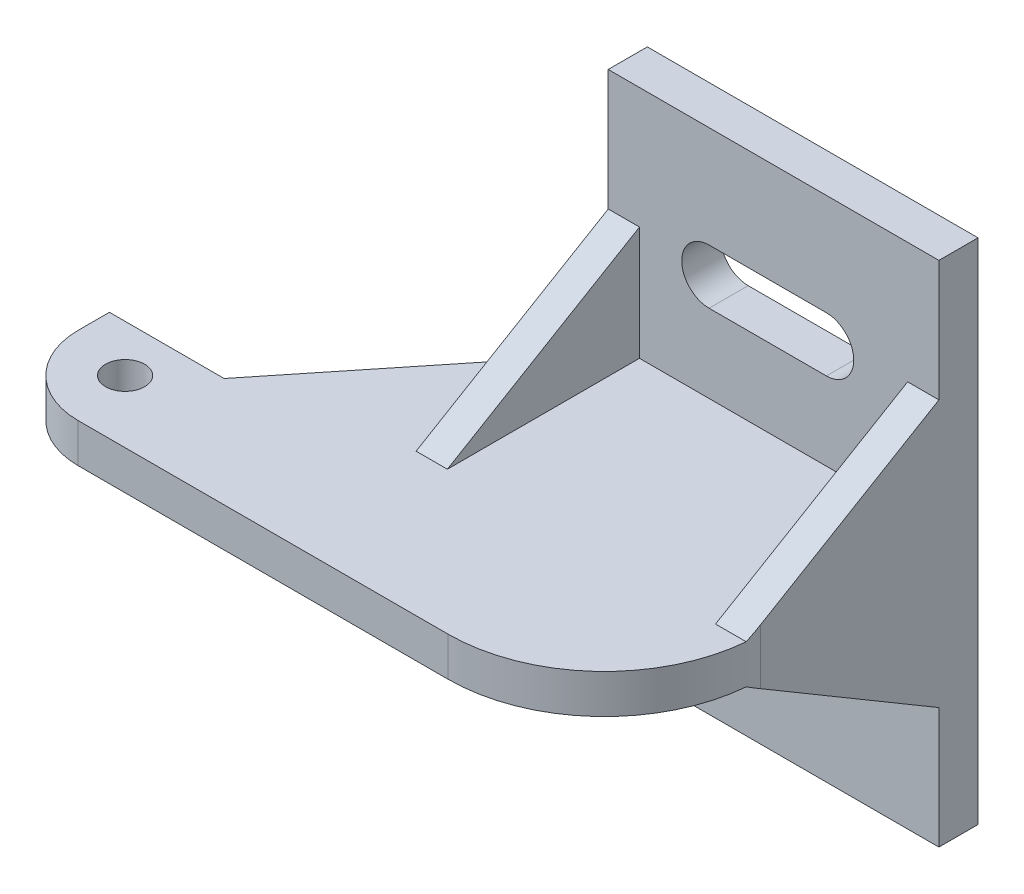
ISO-10303-21;
HEADER;
FILE_DESCRIPTION(('STEP AP214'),'2;1');
FILE_NAME('part.step','',(''),(''),'','','');
FILE_SCHEMA(('AUTOMOTIVE_DESIGN { 1 0 10303 214 1 1 1 1 }'));
ENDSEC;
DATA;
#1=APPLICATION_CONTEXT('core data for automotive mechanical design processes');
#2=APPLICATION_PROTOCOL_DEFINITION('international standard','automotive_design',2000,#1);
#3=PRODUCT_CONTEXT('',#1,'mechanical');
#4=PRODUCT('Part','Part','',(#3));
#5=PRODUCT_RELATED_PRODUCT_CATEGORY('part','',(#4));
#6=PRODUCT_DEFINITION_FORMATION('','',#4);
#7=PRODUCT_DEFINITION_CONTEXT('part definition',#1,'design');
#8=PRODUCT_DEFINITION('design','',#6,#7);
#9=PRODUCT_DEFINITION_SHAPE('','',#8);
#10=(LENGTH_UNIT() NAMED_UNIT(*) SI_UNIT(.MILLI.,.METRE.));
#11=(NAMED_UNIT(*) PLANE_ANGLE_UNIT() SI_UNIT($,.RADIAN.));
#12=(NAMED_UNIT(*) SI_UNIT($,.STERADIAN.) SOLID_ANGLE_UNIT());
#13=UNCERTAINTY_MEASURE_WITH_UNIT(LENGTH_MEASURE(1.E-05),#10,'distance_accuracy_value','');
#14=(GEOMETRIC_REPRESENTATION_CONTEXT(3) GLOBAL_UNCERTAINTY_ASSIGNED_CONTEXT((#13)) GLOBAL_UNIT_ASSIGNED_CONTEXT((#10,
#11,#12)) REPRESENTATION_CONTEXT('',''));
#15=CARTESIAN_POINT('',(0.,0.,0.));
#16=DIRECTION('',(0.,0.,1.));
#17=DIRECTION('',(1.,0.,0.));
#18=AXIS2_PLACEMENT_3D('',#15,#16,#17);
#19=CARTESIAN_POINT('',(-20.4052947075531,5.,-3.0084051724138));
#20=DIRECTION('',(1.,0.,0.));
#21=DIRECTION('',(0.,0.,-1.));
#22=AXIS2_PLACEMENT_3D('',#19,#20,#21);
#23=PLANE('',#22);
#24=DIRECTION('',(0.,-1.,0.));
#25=VECTOR('',#24,1.);
#26=CARTESIAN_POINT('',(-20.4052947075531,5.,-34.3255884704305));
#27=LINE('',#26,#25);
#28=CARTESIAN_POINT('',(-20.4052947075531,5.,-34.3255884704305));
#29=VERTEX_POINT('',#28);
#30=CARTESIAN_POINT('',(-20.4052947075531,0.,-34.3255884704305));
#31=VERTEX_POINT('',#30);
#32=EDGE_CURVE('E234',#29,#31,#27,.T.);
#33=ORIENTED_EDGE('',*,*,#32,.F.);
#34=DIRECTION('',(0.,0.,1.));
#35=VECTOR('',#34,1.);
#36=CARTESIAN_POINT('',(-20.4052947075531,5.,-34.3255884704305));
#37=LINE('',#36,#35);
#38=CARTESIAN_POINT('',(-20.4052947075531,5.,-13.2334051724138));
#39=VERTEX_POINT('',#38);
#40=EDGE_CURVE('E235',#29,#39,#37,.T.);
#41=ORIENTED_EDGE('',*,*,#40,.T.);
#42=DIRECTION('',(0.,0.509243924105354,-0.860622231738049));
#43=VECTOR('',#42,1.);
#44=CARTESIAN_POINT('',(-20.4052947075531,22.5,-42.8084051724138));
#45=LINE('',#44,#43);
#46=CARTESIAN_POINT('',(-20.4052947075531,19.5414201183432,-37.8084051724138));
#47=VERTEX_POINT('',#46);
#48=EDGE_CURVE('E342',#39,#47,#45,.T.);
#49=ORIENTED_EDGE('',*,*,#48,.T.);
#50=DIRECTION('',(0.,-1.,0.));
#51=VECTOR('',#50,1.);
#52=CARTESIAN_POINT('',(-20.4052947075531,35.,-37.8084051724138));
#53=LINE('',#52,#51);
#54=CARTESIAN_POINT('',(-20.4052947075531,35.,-37.8084051724138));
#55=VERTEX_POINT('',#54);
#56=EDGE_CURVE('E458',#55,#47,#53,.T.);
#57=ORIENTED_EDGE('',*,*,#56,.F.);
#58=DIRECTION('',(0.,0.,1.));
#59=VECTOR('',#58,1.);
#60=CARTESIAN_POINT('',(-20.4052947075531,35.,-37.8084051724138));
#61=LINE('',#60,#59);
#62=CARTESIAN_POINT('',(-20.4052947075531,35.,-42.8084051724138));
#63=VERTEX_POINT('',#62);
#64=EDGE_CURVE('E448',#63,#55,#61,.T.);
#65=ORIENTED_EDGE('',*,*,#64,.F.);
#66=DIRECTION('',(0.,-1.,0.));
#67=VECTOR('',#66,1.);
#68=CARTESIAN_POINT('',(-20.4052947075531,5.,-42.8084051724138));
#69=LINE('',#68,#67);
#70=CARTESIAN_POINT('',(-20.4052947075531,-30.,-42.8084051724138));
#71=VERTEX_POINT('',#70);
#72=EDGE_CURVE('E461',#63,#71,#69,.T.);
#73=ORIENTED_EDGE('',*,*,#72,.T.);
#74=DIRECTION('',(0.,0.,1.));
#75=VECTOR('',#74,1.);
#76=CARTESIAN_POINT('',(-20.4052947075531,-30.,-37.8084051724138));
#77=LINE('',#76,#75);
#78=CARTESIAN_POINT('',(-20.4052947075531,-30.,-37.8084051724138));
#79=VERTEX_POINT('',#78);
#80=EDGE_CURVE('E436',#71,#79,#77,.T.);
#81=ORIENTED_EDGE('',*,*,#80,.T.);
#82=CARTESIAN_POINT('',(-20.4052947075531,-14.5414201183432,-37.8084051724138));
#83=VERTEX_POINT('',#82);
#84=EDGE_CURVE('E457',#83,#79,#53,.T.);
#85=ORIENTED_EDGE('',*,*,#84,.F.);
#86=DIRECTION('',(0.,0.509243924105354,0.860622231738049));
#87=VECTOR('',#86,1.);
#88=CARTESIAN_POINT('',(-20.4052947075531,2.5,-9.00840517241379));
#89=LINE('',#88,#87);
#90=CARTESIAN_POINT('',(-20.4052947075531,0.,-13.2334051724138));
#91=VERTEX_POINT('',#90);
#92=EDGE_CURVE('E337',#83,#91,#89,.T.);
#93=ORIENTED_EDGE('',*,*,#92,.T.);
#94=DIRECTION('',(0.,0.,1.));
#95=VECTOR('',#94,1.);
#96=CARTESIAN_POINT('',(-20.4052947075531,0.,-34.3255884704305));
#97=LINE('',#96,#95);
#98=EDGE_CURVE('E244',#31,#91,#97,.T.);
#99=ORIENTED_EDGE('',*,*,#98,.F.);
#100=EDGE_LOOP('',(#33,#41,#49,#57,#65,#73,#81,#85,#93,#99));
#101=FACE_BOUND('',#100,.T.);
#102=ADVANCED_FACE('F32',(#101),#23,.F.);
#103=CARTESIAN_POINT('',(0.,5.,0.));
#104=DIRECTION('',(0.,1.,0.));
#105=DIRECTION('',(0.,0.,1.));
#106=AXIS2_PLACEMENT_3D('',#103,#104,#105);
#107=PLANE('',#106);
#108=CARTESIAN_POINT('',(-47.4052947075531,5.,-3.0084051724138));
#109=DIRECTION('',(0.,1.,0.));
#110=DIRECTION('',(0.,0.,1.));
#111=AXIS2_PLACEMENT_3D('',#108,#109,#110);
#112=CIRCLE('',#111,2.5);
#113=CARTESIAN_POINT('',(-47.4052947075531,5.,-0.508405172413793));
#114=VERTEX_POINT('',#113);
#115=EDGE_CURVE('E280',#114,#114,#112,.T.);
#116=ORIENTED_EDGE('',*,*,#115,.F.);
#117=EDGE_LOOP('',(#116));
#118=FACE_BOUND('',#117,.T.);
#119=DIRECTION('',(1.,0.,0.));
#120=VECTOR('',#119,1.);
#121=CARTESIAN_POINT('',(-20.4052947075531,5.,4.9915948275862));
#122=LINE('',#121,#120);
#123=CARTESIAN_POINT('',(-45.4052947075531,5.,4.9915948275862));
#124=VERTEX_POINT('',#123);
#125=CARTESIAN_POINT('',(1.89470529244692,5.,4.9915948275862));
#126=VERTEX_POINT('',#125);
#127=EDGE_CURVE('E299',#124,#126,#122,.T.);
#128=ORIENTED_EDGE('',*,*,#127,.T.);
#129=CARTESIAN_POINT('',(1.89470529244693,5.,-15.0084051724138));
#130=DIRECTION('',(0.,1.,0.));
#131=DIRECTION('',(0.,0.,1.));
#132=AXIS2_PLACEMENT_3D('',#129,#130,#131);
#133=CIRCLE('',#132,20.);
#134=CARTESIAN_POINT('',(21.8157839530014,5.,-13.2334051724138));
#135=VERTEX_POINT('',#134);
#136=EDGE_CURVE('E40',#126,#135,#133,.T.);
#137=ORIENTED_EDGE('',*,*,#136,.T.);
#138=DIRECTION('',(1.,0.,0.));
#139=VECTOR('',#138,1.);
#140=CARTESIAN_POINT('',(17.8947052924469,5.,-13.2334051724138));
#141=LINE('',#140,#139);
#142=CARTESIAN_POINT('',(17.8947052924469,5.,-13.2334051724138));
#143=VERTEX_POINT('',#142);
#144=EDGE_CURVE('E309',#143,#135,#141,.T.);
#145=ORIENTED_EDGE('',*,*,#144,.F.);
#146=DIRECTION('',(0.,0.,-1.));
#147=VECTOR('',#146,1.);
#148=CARTESIAN_POINT('',(17.8947052924469,5.,0.));
#149=LINE('',#148,#147);
#150=CARTESIAN_POINT('',(17.8947052924469,5.00000000000001,-37.8084051724138));
#151=VERTEX_POINT('',#150);
#152=EDGE_CURVE('E334',#143,#151,#149,.T.);
#153=ORIENTED_EDGE('',*,*,#152,.T.);
#154=DIRECTION('',(-1.,0.,0.));
#155=VECTOR('',#154,1.);
#156=CARTESIAN_POINT('',(0.,5.,-37.8084051724138));
#157=LINE('',#156,#155);
#158=CARTESIAN_POINT('',(-16.4052947075531,5.,-37.8084051724138));
#159=VERTEX_POINT('',#158);
#160=EDGE_CURVE('E300',#151,#159,#157,.T.);
#161=ORIENTED_EDGE('',*,*,#160,.T.);
#162=DIRECTION('',(0.,0.,-1.));
#163=VECTOR('',#162,1.);
#164=CARTESIAN_POINT('',(-16.4052947075531,5.,0.));
#165=LINE('',#164,#163);
#166=CARTESIAN_POINT('',(-16.4052947075531,5.,-13.2334051724138));
#167=VERTEX_POINT('',#166);
#168=EDGE_CURVE('E359',#167,#159,#165,.T.);
#169=ORIENTED_EDGE('',*,*,#168,.F.);
#170=DIRECTION('',(1.,0.,0.));
#171=VECTOR('',#170,1.);
#172=CARTESIAN_POINT('',(0.,5.,-13.2334051724138));
#173=LINE('',#172,#171);
#174=EDGE_CURVE('E356',#39,#167,#173,.T.);
#175=ORIENTED_EDGE('',*,*,#174,.F.);
#176=ORIENTED_EDGE('',*,*,#40,.F.);
#177=DIRECTION('',(0.62608531617748,0.,-0.779754561940451));
#178=VECTOR('',#177,1.);
#179=CARTESIAN_POINT('',(-40.7331228262073,5.,-9.0084051724138));
#180=LINE('',#179,#178);
#181=CARTESIAN_POINT('',(-40.7331228262073,5.,-9.0084051724138));
#182=VERTEX_POINT('',#181);
#183=EDGE_CURVE('E226',#182,#29,#180,.T.);
#184=ORIENTED_EDGE('',*,*,#183,.F.);
#185=DIRECTION('',(1.,0.,0.));
#186=VECTOR('',#185,1.);
#187=CARTESIAN_POINT('',(-55.4052947075531,5.,-9.0084051724138));
#188=LINE('',#187,#186);
#189=CARTESIAN_POINT('',(-55.4052947075531,5.,-9.0084051724138));
#190=VERTEX_POINT('',#189);
#191=EDGE_CURVE('E240',#190,#182,#188,.T.);
#192=ORIENTED_EDGE('',*,*,#191,.F.);
#193=DIRECTION('',(0.,0.,-1.));
#194=VECTOR('',#193,1.);
#195=CARTESIAN_POINT('',(-55.4052947075531,5.,4.9915948275862));
#196=LINE('',#195,#194);
#197=CARTESIAN_POINT('',(-55.4052947075531,5.,-5.0084051724138));
#198=VERTEX_POINT('',#197);
#199=EDGE_CURVE('E367',#198,#190,#196,.T.);
#200=ORIENTED_EDGE('',*,*,#199,.F.);
#201=CARTESIAN_POINT('',(-45.4052947075531,5.,-5.0084051724138));
#202=DIRECTION('',(0.,1.,0.));
#203=DIRECTION('',(0.,0.,1.));
#204=AXIS2_PLACEMENT_3D('',#201,#202,#203);
#205=CIRCLE('',#204,10.);
#206=EDGE_CURVE('E263',#198,#124,#205,.T.);
#207=ORIENTED_EDGE('',*,*,#206,.T.);
#208=EDGE_LOOP('',(#128,#137,#145,#153,#161,#169,#175,#176,#184,#192,#200,#207));
#209=FACE_BOUND('',#208,.T.);
#210=ADVANCED_FACE('F238',(#118,#209),#107,.T.);
#211=CARTESIAN_POINT('',(0.,0.,0.));
#212=DIRECTION('',(0.,1.,0.));
#213=DIRECTION('',(0.,0.,1.));
#214=AXIS2_PLACEMENT_3D('',#211,#212,#213);
#215=PLANE('',#214);
#216=CARTESIAN_POINT('',(-47.4052947075531,0.,-3.0084051724138));
#217=DIRECTION('',(0.,1.,0.));
#218=DIRECTION('',(0.,0.,1.));
#219=AXIS2_PLACEMENT_3D('',#216,#217,#218);
#220=CIRCLE('',#219,2.5);
#221=CARTESIAN_POINT('',(-47.4052947075531,0.,-0.508405172413793));
#222=VERTEX_POINT('',#221);
#223=EDGE_CURVE('E276',#222,#222,#220,.T.);
#224=ORIENTED_EDGE('',*,*,#223,.T.);
#225=EDGE_LOOP('',(#224));
#226=FACE_BOUND('',#225,.T.);
#227=DIRECTION('',(1.,0.,0.));
#228=VECTOR('',#227,1.);
#229=CARTESIAN_POINT('',(17.8947052924469,0.,-13.2334051724138));
#230=LINE('',#229,#228);
#231=CARTESIAN_POINT('',(17.8947052924469,0.,-13.2334051724138));
#232=VERTEX_POINT('',#231);
#233=CARTESIAN_POINT('',(21.8157839530014,0.,-13.2334051724138));
#234=VERTEX_POINT('',#233);
#235=EDGE_CURVE('E295',#232,#234,#230,.T.);
#236=ORIENTED_EDGE('',*,*,#235,.T.);
#237=CARTESIAN_POINT('',(1.89470529244693,0.,-15.0084051724138));
#238=DIRECTION('',(0.,1.,0.));
#239=DIRECTION('',(0.,0.,1.));
#240=AXIS2_PLACEMENT_3D('',#237,#238,#239);
#241=CIRCLE('',#240,20.);
#242=CARTESIAN_POINT('',(1.89470529244692,0.,4.9915948275862));
#243=VERTEX_POINT('',#242);
#244=EDGE_CURVE('E285',#234,#243,#241,.F.);
#245=ORIENTED_EDGE('',*,*,#244,.T.);
#246=DIRECTION('',(1.,0.,0.));
#247=VECTOR('',#246,1.);
#248=CARTESIAN_POINT('',(-20.4052947075531,0.,4.9915948275862));
#249=LINE('',#248,#247);
#250=CARTESIAN_POINT('',(-45.4052947075531,0.,4.9915948275862));
#251=VERTEX_POINT('',#250);
#252=EDGE_CURVE('E292',#251,#243,#249,.T.);
#253=ORIENTED_EDGE('',*,*,#252,.F.);
#254=CARTESIAN_POINT('',(-45.4052947075531,0.,-5.0084051724138));
#255=DIRECTION('',(0.,1.,0.));
#256=DIRECTION('',(0.,0.,1.));
#257=AXIS2_PLACEMENT_3D('',#254,#255,#256);
#258=CIRCLE('',#257,10.);
#259=CARTESIAN_POINT('',(-55.4052947075531,0.,-5.0084051724138));
#260=VERTEX_POINT('',#259);
#261=EDGE_CURVE('E268',#251,#260,#258,.F.);
#262=ORIENTED_EDGE('',*,*,#261,.T.);
#263=DIRECTION('',(0.,0.,1.));
#264=VECTOR('',#263,1.);
#265=CARTESIAN_POINT('',(-55.4052947075531,0.,4.9915948275862));
#266=LINE('',#265,#264);
#267=CARTESIAN_POINT('',(-55.4052947075531,0.,-9.0084051724138));
#268=VERTEX_POINT('',#267);
#269=EDGE_CURVE('E253',#268,#260,#266,.T.);
#270=ORIENTED_EDGE('',*,*,#269,.F.);
#271=DIRECTION('',(1.,0.,0.));
#272=VECTOR('',#271,1.);
#273=CARTESIAN_POINT('',(-55.4052947075531,0.,-9.0084051724138));
#274=LINE('',#273,#272);
#275=CARTESIAN_POINT('',(-40.7331228262073,0.,-9.0084051724138));
#276=VERTEX_POINT('',#275);
#277=EDGE_CURVE('E249',#268,#276,#274,.T.);
#278=ORIENTED_EDGE('',*,*,#277,.T.);
#279=DIRECTION('',(0.62608531617748,0.,-0.779754561940451));
#280=VECTOR('',#279,1.);
#281=CARTESIAN_POINT('',(-40.7331228262073,0.,-9.0084051724138));
#282=LINE('',#281,#280);
#283=EDGE_CURVE('E229',#276,#31,#282,.T.);
#284=ORIENTED_EDGE('',*,*,#283,.T.);
#285=ORIENTED_EDGE('',*,*,#98,.T.);
#286=DIRECTION('',(1.,0.,0.));
#287=VECTOR('',#286,1.);
#288=CARTESIAN_POINT('',(0.,0.,-13.2334051724138));
#289=LINE('',#288,#287);
#290=CARTESIAN_POINT('',(-16.4052947075531,0.,-13.2334051724138));
#291=VERTEX_POINT('',#290);
#292=EDGE_CURVE('E352',#91,#291,#289,.T.);
#293=ORIENTED_EDGE('',*,*,#292,.T.);
#294=DIRECTION('',(0.,0.,-1.));
#295=VECTOR('',#294,1.);
#296=CARTESIAN_POINT('',(-16.4052947075531,0.,0.));
#297=LINE('',#296,#295);
#298=CARTESIAN_POINT('',(-16.4052947075531,0.,-37.8084051724138));
#299=VERTEX_POINT('',#298);
#300=EDGE_CURVE('E364',#291,#299,#297,.T.);
#301=ORIENTED_EDGE('',*,*,#300,.T.);
#302=DIRECTION('',(-1.,0.,0.));
#303=VECTOR('',#302,1.);
#304=CARTESIAN_POINT('',(0.,0.,-37.8084051724138));
#305=LINE('',#304,#303);
#306=CARTESIAN_POINT('',(17.8947052924469,0.,-37.8084051724138));
#307=VERTEX_POINT('',#306);
#308=EDGE_CURVE('E264',#307,#299,#305,.T.);
#309=ORIENTED_EDGE('',*,*,#308,.F.);
#310=DIRECTION('',(0.,0.,-1.));
#311=VECTOR('',#310,1.);
#312=CARTESIAN_POINT('',(17.8947052924469,0.,0.));
#313=LINE('',#312,#311);
#314=EDGE_CURVE('E327',#232,#307,#313,.T.);
#315=ORIENTED_EDGE('',*,*,#314,.F.);
#316=EDGE_LOOP('',(#236,#245,#253,#262,#270,#278,#284,#285,#293,#301,#309,#315));
#317=FACE_BOUND('',#316,.T.);
#318=ADVANCED_FACE('F291',(#226,#317),#215,.F.);
#319=CARTESIAN_POINT('',(21.8947052924469,5.,-3.0084051724138));
#320=DIRECTION('',(-1.,0.,0.));
#321=DIRECTION('',(0.,0.,1.));
#322=AXIS2_PLACEMENT_3D('',#319,#320,#321);
#323=PLANE('',#322);
#324=DIRECTION('',(0.,-0.509243924105354,0.860622231738049));
#325=VECTOR('',#324,1.);
#326=CARTESIAN_POINT('',(21.8947052924469,5.,-13.2334051724138));
#327=LINE('',#326,#325);
#328=CARTESIAN_POINT('',(21.8947052924469,19.5414201183432,-37.8084051724138));
#329=VERTEX_POINT('',#328);
#330=CARTESIAN_POINT('',(21.8947052924469,6.05029585798817,-15.0084051724138));
#331=VERTEX_POINT('',#330);
#332=EDGE_CURVE('E279',#329,#331,#327,.T.);
#333=ORIENTED_EDGE('',*,*,#332,.T.);
#334=DIRECTION('',(0.,-1.,0.));
#335=VECTOR('',#334,1.);
#336=CARTESIAN_POINT('',(21.8947052924469,5.,-15.0084051724138));
#337=LINE('',#336,#335);
#338=CARTESIAN_POINT('',(21.8947052924469,-1.05029585798817,-15.0084051724138));
#339=VERTEX_POINT('',#338);
#340=EDGE_CURVE('E275',#331,#339,#337,.T.);
#341=ORIENTED_EDGE('',*,*,#340,.T.);
#342=DIRECTION('',(0.,-0.509243924105354,-0.860622231738049));
#343=VECTOR('',#342,1.);
#344=CARTESIAN_POINT('',(21.8947052924469,-14.5414201183432,-37.8084051724138));
#345=LINE('',#344,#343);
#346=CARTESIAN_POINT('',(21.8947052924469,-14.5414201183432,-37.8084051724138));
#347=VERTEX_POINT('',#346);
#348=EDGE_CURVE('E317',#339,#347,#345,.T.);
#349=ORIENTED_EDGE('',*,*,#348,.T.);
#350=DIRECTION('',(0.,-1.,0.));
#351=VECTOR('',#350,1.);
#352=CARTESIAN_POINT('',(21.8947052924469,35.,-37.8084051724138));
#353=LINE('',#352,#351);
#354=CARTESIAN_POINT('',(21.8947052924469,-30.,-37.8084051724138));
#355=VERTEX_POINT('',#354);
#356=EDGE_CURVE('E455',#347,#355,#353,.T.);
#357=ORIENTED_EDGE('',*,*,#356,.T.);
#358=DIRECTION('',(0.,0.,-1.));
#359=VECTOR('',#358,1.);
#360=CARTESIAN_POINT('',(21.8947052924469,-30.,-37.8084051724138));
#361=LINE('',#360,#359);
#362=CARTESIAN_POINT('',(21.8947052924469,-30.,-42.8084051724138));
#363=VERTEX_POINT('',#362);
#364=EDGE_CURVE('E442',#355,#363,#361,.T.);
#365=ORIENTED_EDGE('',*,*,#364,.T.);
#366=DIRECTION('',(0.,-1.,0.));
#367=VECTOR('',#366,1.);
#368=CARTESIAN_POINT('',(21.8947052924469,5.,-42.8084051724138));
#369=LINE('',#368,#367);
#370=CARTESIAN_POINT('',(21.8947052924469,35.,-42.8084051724138));
#371=VERTEX_POINT('',#370);
#372=EDGE_CURVE('E464',#371,#363,#369,.T.);
#373=ORIENTED_EDGE('',*,*,#372,.F.);
#374=DIRECTION('',(0.,0.,-1.));
#375=VECTOR('',#374,1.);
#376=CARTESIAN_POINT('',(21.8947052924469,35.,-37.8084051724138));
#377=LINE('',#376,#375);
#378=CARTESIAN_POINT('',(21.8947052924469,35.,-37.8084051724138));
#379=VERTEX_POINT('',#378);
#380=EDGE_CURVE('E452',#379,#371,#377,.T.);
#381=ORIENTED_EDGE('',*,*,#380,.F.);
#382=EDGE_CURVE('E316',#379,#329,#353,.T.);
#383=ORIENTED_EDGE('',*,*,#382,.T.);
#384=EDGE_LOOP('',(#333,#341,#349,#357,#365,#373,#381,#383));
#385=FACE_BOUND('',#384,.T.);
#386=ADVANCED_FACE('F312',(#385),#323,.F.);
#387=CARTESIAN_POINT('',(-20.4052947075531,5.,-42.8084051724138));
#388=DIRECTION('',(0.,0.,1.));
#389=DIRECTION('',(1.,0.,0.));
#390=AXIS2_PLACEMENT_3D('',#387,#388,#389);
#391=PLANE('',#390);
#392=DIRECTION('',(-1.,0.,0.));
#393=VECTOR('',#392,1.);
#394=CARTESIAN_POINT('',(21.8947052924469,-30.,-42.8084051724138));
#395=LINE('',#394,#393);
#396=EDGE_CURVE('E433',#363,#71,#395,.T.);
#397=ORIENTED_EDGE('',*,*,#396,.T.);
#398=ORIENTED_EDGE('',*,*,#72,.F.);
#399=DIRECTION('',(-1.,0.,0.));
#400=VECTOR('',#399,1.);
#401=CARTESIAN_POINT('',(21.8947052924469,35.,-42.8084051724138));
#402=LINE('',#401,#400);
#403=EDGE_CURVE('E445',#371,#63,#402,.T.);
#404=ORIENTED_EDGE('',*,*,#403,.F.);
#405=ORIENTED_EDGE('',*,*,#372,.T.);
#406=EDGE_LOOP('',(#397,#398,#404,#405));
#407=FACE_BOUND('',#406,.T.);
#408=DIRECTION('',(-1.,0.,0.));
#409=VECTOR('',#408,1.);
#410=CARTESIAN_POINT('',(-20.4052947075531,-10.,-42.8084051724138));
#411=LINE('',#410,#409);
#412=CARTESIAN_POINT('',(7.5,-10.,-42.8084051724138));
#413=VERTEX_POINT('',#412);
#414=CARTESIAN_POINT('',(-7.5,-10.,-42.8084051724138));
#415=VERTEX_POINT('',#414);
#416=EDGE_CURVE('E395',#413,#415,#411,.T.);
#417=ORIENTED_EDGE('',*,*,#416,.T.);
#418=CARTESIAN_POINT('',(-7.5,-13.5,-42.8084051724138));
#419=DIRECTION('',(0.,0.,1.));
#420=DIRECTION('',(1.,0.,0.));
#421=AXIS2_PLACEMENT_3D('',#418,#419,#420);
#422=CIRCLE('',#421,3.5);
#423=CARTESIAN_POINT('',(-7.5,-17.,-42.8084051724138));
#424=VERTEX_POINT('',#423);
#425=EDGE_CURVE('E398',#415,#424,#422,.T.);
#426=ORIENTED_EDGE('',*,*,#425,.T.);
#427=DIRECTION('',(1.,0.,0.));
#428=VECTOR('',#427,1.);
#429=CARTESIAN_POINT('',(-20.4052947075531,-17.,-42.8084051724138));
#430=LINE('',#429,#428);
#431=CARTESIAN_POINT('',(7.5,-17.,-42.8084051724138));
#432=VERTEX_POINT('',#431);
#433=EDGE_CURVE('E383',#424,#432,#430,.T.);
#434=ORIENTED_EDGE('',*,*,#433,.T.);
#435=CARTESIAN_POINT('',(7.5,-13.5,-42.8084051724138));
#436=DIRECTION('',(0.,0.,1.));
#437=DIRECTION('',(1.,0.,0.));
#438=AXIS2_PLACEMENT_3D('',#435,#436,#437);
#439=CIRCLE('',#438,3.5);
#440=EDGE_CURVE('E392',#432,#413,#439,.T.);
#441=ORIENTED_EDGE('',*,*,#440,.T.);
#442=EDGE_LOOP('',(#417,#426,#434,#441));
#443=FACE_BOUND('',#442,.T.);
#444=DIRECTION('',(-1.,0.,0.));
#445=VECTOR('',#444,1.);
#446=CARTESIAN_POINT('',(-20.4052947075531,22.,-42.8084051724138));
#447=LINE('',#446,#445);
#448=CARTESIAN_POINT('',(7.5,22.,-42.8084051724138));
#449=VERTEX_POINT('',#448);
#450=CARTESIAN_POINT('',(-7.5,22.,-42.8084051724138));
#451=VERTEX_POINT('',#450);
#452=EDGE_CURVE('E427',#449,#451,#447,.T.);
#453=ORIENTED_EDGE('',*,*,#452,.T.);
#454=CARTESIAN_POINT('',(-7.5,18.5,-42.8084051724138));
#455=DIRECTION('',(0.,0.,1.));
#456=DIRECTION('',(1.,0.,0.));
#457=AXIS2_PLACEMENT_3D('',#454,#455,#456);
#458=CIRCLE('',#457,3.5);
#459=CARTESIAN_POINT('',(-7.5,15.,-42.8084051724138));
#460=VERTEX_POINT('',#459);
#461=EDGE_CURVE('E430',#451,#460,#458,.T.);
#462=ORIENTED_EDGE('',*,*,#461,.T.);
#463=DIRECTION('',(1.,0.,0.));
#464=VECTOR('',#463,1.);
#465=CARTESIAN_POINT('',(-20.4052947075531,15.,-42.8084051724138));
#466=LINE('',#465,#464);
#467=CARTESIAN_POINT('',(7.5,15.,-42.8084051724138));
#468=VERTEX_POINT('',#467);
#469=EDGE_CURVE('E415',#460,#468,#466,.T.);
#470=ORIENTED_EDGE('',*,*,#469,.T.);
#471=CARTESIAN_POINT('',(7.5,18.5,-42.8084051724138));
#472=DIRECTION('',(0.,0.,1.));
#473=DIRECTION('',(1.,0.,0.));
#474=AXIS2_PLACEMENT_3D('',#471,#472,#473);
#475=CIRCLE('',#474,3.5);
#476=EDGE_CURVE('E424',#468,#449,#475,.T.);
#477=ORIENTED_EDGE('',*,*,#476,.T.);
#478=EDGE_LOOP('',(#453,#462,#470,#477));
#479=FACE_BOUND('',#478,.T.);
#480=ADVANCED_FACE('F494',(#407,#443,#479),#391,.F.);
#481=CARTESIAN_POINT('',(-20.4052947075531,5.,4.9915948275862));
#482=DIRECTION('',(0.,0.,-1.));
#483=DIRECTION('',(-1.,0.,0.));
#484=AXIS2_PLACEMENT_3D('',#481,#482,#483);
#485=PLANE('',#484);
#486=ORIENTED_EDGE('',*,*,#252,.T.);
#487=DIRECTION('',(0.,-1.,0.));
#488=VECTOR('',#487,1.);
#489=CARTESIAN_POINT('',(1.89470529244692,5.,4.9915948275862));
#490=LINE('',#489,#488);
#491=EDGE_CURVE('E54',#243,#126,#490,.F.);
#492=ORIENTED_EDGE('',*,*,#491,.T.);
#493=ORIENTED_EDGE('',*,*,#127,.F.);
#494=DIRECTION('',(0.,1.,0.));
#495=VECTOR('',#494,1.);
#496=CARTESIAN_POINT('',(-45.4052947075531,5.,4.9915948275862));
#497=LINE('',#496,#495);
#498=EDGE_CURVE('E266',#124,#251,#497,.F.);
#499=ORIENTED_EDGE('',*,*,#498,.T.);
#500=EDGE_LOOP('',(#486,#492,#493,#499));
#501=FACE_BOUND('',#500,.T.);
#502=ADVANCED_FACE('F297',(#501),#485,.F.);
#503=CARTESIAN_POINT('',(0.,-30.,0.));
#504=DIRECTION('',(0.,-1.,0.));
#505=DIRECTION('',(0.,0.,-1.));
#506=AXIS2_PLACEMENT_3D('',#503,#504,#505);
#507=PLANE('',#506);
#508=ORIENTED_EDGE('',*,*,#396,.F.);
#509=ORIENTED_EDGE('',*,*,#364,.F.);
#510=DIRECTION('',(1.,0.,0.));
#511=VECTOR('',#510,1.);
#512=CARTESIAN_POINT('',(21.8947052924469,-30.,-37.8084051724138));
#513=LINE('',#512,#511);
#514=EDGE_CURVE('E439',#79,#355,#513,.T.);
#515=ORIENTED_EDGE('',*,*,#514,.F.);
#516=ORIENTED_EDGE('',*,*,#80,.F.);
#517=EDGE_LOOP('',(#508,#509,#515,#516));
#518=FACE_BOUND('',#517,.T.);
#519=ADVANCED_FACE('F489',(#518),#507,.T.);
#520=CARTESIAN_POINT('',(21.8947052924469,35.,-37.8084051724138));
#521=DIRECTION('',(0.,0.,-1.));
#522=DIRECTION('',(-1.,0.,0.));
#523=AXIS2_PLACEMENT_3D('',#520,#521,#522);
#524=PLANE('',#523);
#525=DIRECTION('',(1.,0.,0.));
#526=VECTOR('',#525,1.);
#527=CARTESIAN_POINT('',(-7.5,-17.,-37.8084051724138));
#528=LINE('',#527,#526);
#529=CARTESIAN_POINT('',(-7.5,-17.,-37.8084051724138));
#530=VERTEX_POINT('',#529);
#531=CARTESIAN_POINT('',(7.5,-17.,-37.8084051724138));
#532=VERTEX_POINT('',#531);
#533=EDGE_CURVE('E251',#530,#532,#528,.T.);
#534=ORIENTED_EDGE('',*,*,#533,.F.);
#535=CARTESIAN_POINT('',(-7.5,-13.5,-37.8084051724138));
#536=DIRECTION('',(0.,0.,1.));
#537=DIRECTION('',(1.,0.,0.));
#538=AXIS2_PLACEMENT_3D('',#535,#536,#537);
#539=CIRCLE('',#538,3.5);
#540=CARTESIAN_POINT('',(-7.5,-10.,-37.8084051724138));
#541=VERTEX_POINT('',#540);
#542=EDGE_CURVE('E248',#541,#530,#539,.T.);
#543=ORIENTED_EDGE('',*,*,#542,.F.);
#544=DIRECTION('',(-1.,0.,0.));
#545=VECTOR('',#544,1.);
#546=CARTESIAN_POINT('',(-7.5,-10.,-37.8084051724138));
#547=LINE('',#546,#545);
#548=CARTESIAN_POINT('',(7.5,-10.,-37.8084051724138));
#549=VERTEX_POINT('',#548);
#550=EDGE_CURVE('E377',#549,#541,#547,.T.);
#551=ORIENTED_EDGE('',*,*,#550,.F.);
#552=CARTESIAN_POINT('',(7.5,-13.5,-37.8084051724138));
#553=DIRECTION('',(0.,0.,1.));
#554=DIRECTION('',(1.,0.,0.));
#555=AXIS2_PLACEMENT_3D('',#552,#553,#554);
#556=CIRCLE('',#555,3.5);
#557=EDGE_CURVE('E374',#532,#549,#556,.T.);
#558=ORIENTED_EDGE('',*,*,#557,.F.);
#559=EDGE_LOOP('',(#534,#543,#551,#558));
#560=FACE_BOUND('',#559,.T.);
#561=ORIENTED_EDGE('',*,*,#356,.F.);
#562=DIRECTION('',(1.,0.,0.));
#563=VECTOR('',#562,1.);
#564=CARTESIAN_POINT('',(17.8947052924469,-14.5414201183432,-37.8084051724138));
#565=LINE('',#564,#563);
#566=CARTESIAN_POINT('',(17.8947052924469,-14.5414201183432,-37.8084051724138));
#567=VERTEX_POINT('',#566);
#568=EDGE_CURVE('E328',#567,#347,#565,.T.);
#569=ORIENTED_EDGE('',*,*,#568,.F.);
#570=DIRECTION('',(0.,1.,0.));
#571=VECTOR('',#570,1.);
#572=CARTESIAN_POINT('',(17.8947052924469,19.5414201183432,-37.8084051724138));
#573=LINE('',#572,#571);
#574=EDGE_CURVE('E322',#567,#307,#573,.T.);
#575=ORIENTED_EDGE('',*,*,#574,.T.);
#576=ORIENTED_EDGE('',*,*,#308,.T.);
#577=DIRECTION('',(0.,-1.,0.));
#578=VECTOR('',#577,1.);
#579=CARTESIAN_POINT('',(-16.4052947075531,35.,-37.8084051724138));
#580=LINE('',#579,#578);
#581=CARTESIAN_POINT('',(-16.4052947075531,-14.5414201183432,-37.8084051724138));
#582=VERTEX_POINT('',#581);
#583=EDGE_CURVE('E362',#299,#582,#580,.T.);
#584=ORIENTED_EDGE('',*,*,#583,.T.);
#585=DIRECTION('',(-1.,0.,0.));
#586=VECTOR('',#585,1.);
#587=CARTESIAN_POINT('',(21.8947052924469,-14.5414201183432,-37.8084051724138));
#588=LINE('',#587,#586);
#589=EDGE_CURVE('E345',#582,#83,#588,.T.);
#590=ORIENTED_EDGE('',*,*,#589,.T.);
#591=ORIENTED_EDGE('',*,*,#84,.T.);
#592=ORIENTED_EDGE('',*,*,#514,.T.);
#593=EDGE_LOOP('',(#561,#569,#575,#576,#584,#590,#591,#592));
#594=FACE_BOUND('',#593,.T.);
#595=ADVANCED_FACE('F470',(#560,#594),#524,.F.);
#596=DIRECTION('',(1.,0.,0.));
#597=VECTOR('',#596,1.);
#598=CARTESIAN_POINT('',(-7.5,15.,-37.8084051724138));
#599=LINE('',#598,#597);
#600=CARTESIAN_POINT('',(-7.5,15.,-37.8084051724138));
#601=VERTEX_POINT('',#600);
#602=CARTESIAN_POINT('',(7.5,15.,-37.8084051724138));
#603=VERTEX_POINT('',#602);
#604=EDGE_CURVE('E403',#601,#603,#599,.T.);
#605=ORIENTED_EDGE('',*,*,#604,.F.);
#606=CARTESIAN_POINT('',(-7.5,18.5,-37.8084051724138));
#607=DIRECTION('',(0.,0.,1.));
#608=DIRECTION('',(1.,0.,0.));
#609=AXIS2_PLACEMENT_3D('',#606,#607,#608);
#610=CIRCLE('',#609,3.5);
#611=CARTESIAN_POINT('',(-7.5,22.,-37.8084051724138));
#612=VERTEX_POINT('',#611);
#613=EDGE_CURVE('E401',#612,#601,#610,.T.);
#614=ORIENTED_EDGE('',*,*,#613,.F.);
#615=DIRECTION('',(-1.,0.,0.));
#616=VECTOR('',#615,1.);
#617=CARTESIAN_POINT('',(-7.5,22.,-37.8084051724138));
#618=LINE('',#617,#616);
#619=CARTESIAN_POINT('',(7.5,22.,-37.8084051724138));
#620=VERTEX_POINT('',#619);
#621=EDGE_CURVE('E409',#620,#612,#618,.T.);
#622=ORIENTED_EDGE('',*,*,#621,.F.);
#623=CARTESIAN_POINT('',(7.5,18.5,-37.8084051724138));
#624=DIRECTION('',(0.,0.,1.));
#625=DIRECTION('',(1.,0.,0.));
#626=AXIS2_PLACEMENT_3D('',#623,#624,#625);
#627=CIRCLE('',#626,3.5);
#628=EDGE_CURVE('E406',#603,#620,#627,.T.);
#629=ORIENTED_EDGE('',*,*,#628,.F.);
#630=EDGE_LOOP('',(#605,#614,#622,#629));
#631=FACE_BOUND('',#630,.T.);
#632=DIRECTION('',(0.,-1.,0.));
#633=VECTOR('',#632,1.);
#634=CARTESIAN_POINT('',(17.8947052924469,35.,-37.8084051724138));
#635=LINE('',#634,#633);
#636=CARTESIAN_POINT('',(17.8947052924469,19.5414201183432,-37.8084051724138));
#637=VERTEX_POINT('',#636);
#638=EDGE_CURVE('E273',#637,#151,#635,.T.);
#639=ORIENTED_EDGE('',*,*,#638,.F.);
#640=DIRECTION('',(1.,0.,0.));
#641=VECTOR('',#640,1.);
#642=CARTESIAN_POINT('',(17.8947052924469,19.5414201183432,-37.8084051724138));
#643=LINE('',#642,#641);
#644=EDGE_CURVE('E325',#637,#329,#643,.T.);
#645=ORIENTED_EDGE('',*,*,#644,.T.);
#646=ORIENTED_EDGE('',*,*,#382,.F.);
#647=DIRECTION('',(1.,0.,0.));
#648=VECTOR('',#647,1.);
#649=CARTESIAN_POINT('',(21.8947052924469,35.,-37.8084051724138));
#650=LINE('',#649,#648);
#651=EDGE_CURVE('E450',#55,#379,#650,.T.);
#652=ORIENTED_EDGE('',*,*,#651,.F.);
#653=ORIENTED_EDGE('',*,*,#56,.T.);
#654=DIRECTION('',(1.,0.,0.));
#655=VECTOR('',#654,1.);
#656=CARTESIAN_POINT('',(21.8947052924469,19.5414201183432,-37.8084051724138));
#657=LINE('',#656,#655);
#658=CARTESIAN_POINT('',(-16.4052947075531,19.5414201183432,-37.8084051724138));
#659=VERTEX_POINT('',#658);
#660=EDGE_CURVE('E354',#47,#659,#657,.T.);
#661=ORIENTED_EDGE('',*,*,#660,.T.);
#662=DIRECTION('',(0.,-1.,0.));
#663=VECTOR('',#662,1.);
#664=CARTESIAN_POINT('',(-16.4052947075531,35.,-37.8084051724138));
#665=LINE('',#664,#663);
#666=EDGE_CURVE('E270',#659,#159,#665,.T.);
#667=ORIENTED_EDGE('',*,*,#666,.T.);
#668=ORIENTED_EDGE('',*,*,#160,.F.);
#669=EDGE_LOOP('',(#639,#645,#646,#652,#653,#661,#667,#668));
#670=FACE_BOUND('',#669,.T.);
#671=ADVANCED_FACE('F556',(#631,#670),#524,.F.);
#672=CARTESIAN_POINT('',(0.,35.,0.));
#673=DIRECTION('',(0.,-1.,0.));
#674=DIRECTION('',(0.,0.,-1.));
#675=AXIS2_PLACEMENT_3D('',#672,#673,#674);
#676=PLANE('',#675);
#677=ORIENTED_EDGE('',*,*,#403,.T.);
#678=ORIENTED_EDGE('',*,*,#64,.T.);
#679=ORIENTED_EDGE('',*,*,#651,.T.);
#680=ORIENTED_EDGE('',*,*,#380,.T.);
#681=EDGE_LOOP('',(#677,#678,#679,#680));
#682=FACE_BOUND('',#681,.T.);
#683=ADVANCED_FACE('F564',(#682),#676,.F.);
#684=CARTESIAN_POINT('',(-7.5,18.5,-47.8084051724138));
#685=DIRECTION('',(0.,0.,1.));
#686=DIRECTION('',(1.,0.,0.));
#687=AXIS2_PLACEMENT_3D('',#684,#685,#686);
#688=CYLINDRICAL_SURFACE('',#687,3.5);
#689=DIRECTION('',(0.,0.,1.));
#690=VECTOR('',#689,1.);
#691=CARTESIAN_POINT('',(-7.5,22.,-47.8084051724138));
#692=LINE('',#691,#690);
#693=EDGE_CURVE('E413',#451,#612,#692,.T.);
#694=ORIENTED_EDGE('',*,*,#693,.T.);
#695=ORIENTED_EDGE('',*,*,#613,.T.);
#696=DIRECTION('',(0.,0.,1.));
#697=VECTOR('',#696,1.);
#698=CARTESIAN_POINT('',(-7.5,15.,-47.8084051724138));
#699=LINE('',#698,#697);
#700=EDGE_CURVE('E412',#460,#601,#699,.T.);
#701=ORIENTED_EDGE('',*,*,#700,.F.);
#702=ORIENTED_EDGE('',*,*,#461,.F.);
#703=EDGE_LOOP('',(#694,#695,#701,#702));
#704=FACE_BOUND('',#703,.T.);
#705=ADVANCED_FACE('F566',(#704),#688,.F.);
#706=CARTESIAN_POINT('',(-7.5,22.,-47.8084051724138));
#707=DIRECTION('',(0.,1.,0.));
#708=DIRECTION('',(0.,0.,1.));
#709=AXIS2_PLACEMENT_3D('',#706,#707,#708);
#710=PLANE('',#709);
#711=DIRECTION('',(0.,0.,1.));
#712=VECTOR('',#711,1.);
#713=CARTESIAN_POINT('',(7.5,22.,-47.8084051724138));
#714=LINE('',#713,#712);
#715=EDGE_CURVE('E416',#449,#620,#714,.T.);
#716=ORIENTED_EDGE('',*,*,#715,.T.);
#717=ORIENTED_EDGE('',*,*,#621,.T.);
#718=ORIENTED_EDGE('',*,*,#693,.F.);
#719=ORIENTED_EDGE('',*,*,#452,.F.);
#720=EDGE_LOOP('',(#716,#717,#718,#719));
#721=FACE_BOUND('',#720,.T.);
#722=ADVANCED_FACE('F572',(#721),#710,.F.);
#723=CARTESIAN_POINT('',(7.5,18.5,-47.8084051724138));
#724=DIRECTION('',(0.,0.,1.));
#725=DIRECTION('',(1.,0.,0.));
#726=AXIS2_PLACEMENT_3D('',#723,#724,#725);
#727=CYLINDRICAL_SURFACE('',#726,3.5);
#728=DIRECTION('',(0.,0.,1.));
#729=VECTOR('',#728,1.);
#730=CARTESIAN_POINT('',(7.5,15.,-47.8084051724138));
#731=LINE('',#730,#729);
#732=EDGE_CURVE('E418',#468,#603,#731,.T.);
#733=ORIENTED_EDGE('',*,*,#732,.T.);
#734=ORIENTED_EDGE('',*,*,#628,.T.);
#735=ORIENTED_EDGE('',*,*,#715,.F.);
#736=ORIENTED_EDGE('',*,*,#476,.F.);
#737=EDGE_LOOP('',(#733,#734,#735,#736));
#738=FACE_BOUND('',#737,.T.);
#739=ADVANCED_FACE('F781',(#738),#727,.F.);
#740=CARTESIAN_POINT('',(-7.5,15.,-47.8084051724138));
#741=DIRECTION('',(0.,-1.,0.));
#742=DIRECTION('',(0.,0.,-1.));
#743=AXIS2_PLACEMENT_3D('',#740,#741,#742);
#744=PLANE('',#743);
#745=ORIENTED_EDGE('',*,*,#700,.T.);
#746=ORIENTED_EDGE('',*,*,#604,.T.);
#747=ORIENTED_EDGE('',*,*,#732,.F.);
#748=ORIENTED_EDGE('',*,*,#469,.F.);
#749=EDGE_LOOP('',(#745,#746,#747,#748));
#750=FACE_BOUND('',#749,.T.);
#751=ADVANCED_FACE('F771',(#750),#744,.F.);
#752=CARTESIAN_POINT('',(-7.5,-13.5,-47.8084051724138));
#753=DIRECTION('',(0.,0.,1.));
#754=DIRECTION('',(1.,0.,0.));
#755=AXIS2_PLACEMENT_3D('',#752,#753,#754);
#756=CYLINDRICAL_SURFACE('',#755,3.5);
#757=DIRECTION('',(0.,0.,1.));
#758=VECTOR('',#757,1.);
#759=CARTESIAN_POINT('',(-7.5,-10.,-47.8084051724138));
#760=LINE('',#759,#758);
#761=EDGE_CURVE('E381',#415,#541,#760,.T.);
#762=ORIENTED_EDGE('',*,*,#761,.T.);
#763=ORIENTED_EDGE('',*,*,#542,.T.);
#764=DIRECTION('',(0.,0.,1.));
#765=VECTOR('',#764,1.);
#766=CARTESIAN_POINT('',(-7.5,-17.,-47.8084051724138));
#767=LINE('',#766,#765);
#768=EDGE_CURVE('E380',#424,#530,#767,.T.);
#769=ORIENTED_EDGE('',*,*,#768,.F.);
#770=ORIENTED_EDGE('',*,*,#425,.F.);
#771=EDGE_LOOP('',(#762,#763,#769,#770));
#772=FACE_BOUND('',#771,.T.);
#773=ADVANCED_FACE('F761',(#772),#756,.F.);
#774=CARTESIAN_POINT('',(-7.5,-10.,-47.8084051724138));
#775=DIRECTION('',(0.,1.,0.));
#776=DIRECTION('',(-1.,0.,0.));
#777=AXIS2_PLACEMENT_3D('',#774,#775,#776);
#778=PLANE('',#777);
#779=DIRECTION('',(0.,0.,1.));
#780=VECTOR('',#779,1.);
#781=CARTESIAN_POINT('',(7.5,-10.,-47.8084051724138));
#782=LINE('',#781,#780);
#783=EDGE_CURVE('E384',#413,#549,#782,.T.);
#784=ORIENTED_EDGE('',*,*,#783,.T.);
#785=ORIENTED_EDGE('',*,*,#550,.T.);
#786=ORIENTED_EDGE('',*,*,#761,.F.);
#787=ORIENTED_EDGE('',*,*,#416,.F.);
#788=EDGE_LOOP('',(#784,#785,#786,#787));
#789=FACE_BOUND('',#788,.T.);
#790=ADVANCED_FACE('F751',(#789),#778,.F.);
#791=CARTESIAN_POINT('',(7.5,-13.5,-47.8084051724138));
#792=DIRECTION('',(0.,0.,1.));
#793=DIRECTION('',(1.,0.,0.));
#794=AXIS2_PLACEMENT_3D('',#791,#792,#793);
#795=CYLINDRICAL_SURFACE('',#794,3.5);
#796=DIRECTION('',(0.,0.,1.));
#797=VECTOR('',#796,1.);
#798=CARTESIAN_POINT('',(7.5,-17.,-47.8084051724138));
#799=LINE('',#798,#797);
#800=EDGE_CURVE('E386',#432,#532,#799,.T.);
#801=ORIENTED_EDGE('',*,*,#800,.T.);
#802=ORIENTED_EDGE('',*,*,#557,.T.);
#803=ORIENTED_EDGE('',*,*,#783,.F.);
#804=ORIENTED_EDGE('',*,*,#440,.F.);
#805=EDGE_LOOP('',(#801,#802,#803,#804));
#806=FACE_BOUND('',#805,.T.);
#807=ADVANCED_FACE('F740',(#806),#795,.F.);
#808=CARTESIAN_POINT('',(-7.5,-17.,-47.8084051724138));
#809=DIRECTION('',(0.,-1.,0.));
#810=DIRECTION('',(1.,0.,0.));
#811=AXIS2_PLACEMENT_3D('',#808,#809,#810);
#812=PLANE('',#811);
#813=ORIENTED_EDGE('',*,*,#768,.T.);
#814=ORIENTED_EDGE('',*,*,#533,.T.);
#815=ORIENTED_EDGE('',*,*,#800,.F.);
#816=ORIENTED_EDGE('',*,*,#433,.F.);
#817=EDGE_LOOP('',(#813,#814,#815,#816));
#818=FACE_BOUND('',#817,.T.);
#819=ADVANCED_FACE('F670',(#818),#812,.F.);
#820=CARTESIAN_POINT('',(-55.4052947075531,5.,-9.0084051724138));
#821=DIRECTION('',(0.,0.,1.));
#822=DIRECTION('',(1.,0.,0.));
#823=AXIS2_PLACEMENT_3D('',#820,#821,#822);
#824=PLANE('',#823);
#825=ORIENTED_EDGE('',*,*,#191,.T.);
#826=DIRECTION('',(0.,-1.,0.));
#827=VECTOR('',#826,1.);
#828=CARTESIAN_POINT('',(-40.7331228262073,5.,-9.0084051724138));
#829=LINE('',#828,#827);
#830=EDGE_CURVE('E223',#182,#276,#829,.T.);
#831=ORIENTED_EDGE('',*,*,#830,.T.);
#832=ORIENTED_EDGE('',*,*,#277,.F.);
#833=DIRECTION('',(0.,-1.,0.));
#834=VECTOR('',#833,1.);
#835=CARTESIAN_POINT('',(-55.4052947075531,5.,-9.0084051724138));
#836=LINE('',#835,#834);
#837=EDGE_CURVE('E247',#190,#268,#836,.T.);
#838=ORIENTED_EDGE('',*,*,#837,.F.);
#839=EDGE_LOOP('',(#825,#831,#832,#838));
#840=FACE_BOUND('',#839,.T.);
#841=ADVANCED_FACE('F246',(#840),#824,.F.);
#842=CARTESIAN_POINT('',(-55.4052947075531,0.,0.));
#843=DIRECTION('',(1.,0.,0.));
#844=DIRECTION('',(0.,0.,-1.));
#845=AXIS2_PLACEMENT_3D('',#842,#843,#844);
#846=PLANE('',#845);
#847=ORIENTED_EDGE('',*,*,#269,.T.);
#848=DIRECTION('',(0.,1.,0.));
#849=VECTOR('',#848,1.);
#850=CARTESIAN_POINT('',(-55.4052947075531,0.,-5.0084051724138));
#851=LINE('',#850,#849);
#852=EDGE_CURVE('E260',#260,#198,#851,.T.);
#853=ORIENTED_EDGE('',*,*,#852,.T.);
#854=ORIENTED_EDGE('',*,*,#199,.T.);
#855=ORIENTED_EDGE('',*,*,#837,.T.);
#856=EDGE_LOOP('',(#847,#853,#854,#855));
#857=FACE_BOUND('',#856,.T.);
#858=ADVANCED_FACE('F531',(#857),#846,.F.);
#859=CARTESIAN_POINT('',(-45.4052947075531,0.,-5.0084051724138));
#860=DIRECTION('',(0.,1.,0.));
#861=DIRECTION('',(0.,0.,1.));
#862=AXIS2_PLACEMENT_3D('',#859,#860,#861);
#863=CYLINDRICAL_SURFACE('',#862,10.);
#864=ORIENTED_EDGE('',*,*,#261,.F.);
#865=ORIENTED_EDGE('',*,*,#498,.F.);
#866=ORIENTED_EDGE('',*,*,#206,.F.);
#867=ORIENTED_EDGE('',*,*,#852,.F.);
#868=EDGE_LOOP('',(#864,#865,#866,#867));
#869=FACE_BOUND('',#868,.T.);
#870=ADVANCED_FACE('F528',(#869),#863,.T.);
#871=CARTESIAN_POINT('',(-16.4052947075531,0.,0.));
#872=DIRECTION('',(1.,0.,0.));
#873=DIRECTION('',(0.,0.,-1.));
#874=AXIS2_PLACEMENT_3D('',#871,#872,#873);
#875=PLANE('',#874);
#876=DIRECTION('',(0.,0.509243924105354,-0.860622231738049));
#877=VECTOR('',#876,1.);
#878=CARTESIAN_POINT('',(-16.4052947075531,22.5,-42.8084051724138));
#879=LINE('',#878,#877);
#880=EDGE_CURVE('E341',#167,#659,#879,.T.);
#881=ORIENTED_EDGE('',*,*,#880,.F.);
#882=ORIENTED_EDGE('',*,*,#168,.T.);
#883=ORIENTED_EDGE('',*,*,#666,.F.);
#884=EDGE_LOOP('',(#881,#882,#883));
#885=FACE_BOUND('',#884,.T.);
#886=ADVANCED_FACE('F530',(#885),#875,.T.);
#887=CARTESIAN_POINT('',(-16.4052947075531,22.5,-42.8084051724138));
#888=DIRECTION('',(0.,0.860622231738049,0.509243924105354));
#889=DIRECTION('',(0.,-0.509243924105354,0.860622231738049));
#890=AXIS2_PLACEMENT_3D('',#887,#888,#889);
#891=PLANE('',#890);
#892=ORIENTED_EDGE('',*,*,#48,.F.);
#893=ORIENTED_EDGE('',*,*,#174,.T.);
#894=ORIENTED_EDGE('',*,*,#880,.T.);
#895=ORIENTED_EDGE('',*,*,#660,.F.);
#896=EDGE_LOOP('',(#892,#893,#894,#895));
#897=FACE_BOUND('',#896,.T.);
#898=ADVANCED_FACE('F537',(#897),#891,.T.);
#899=ORIENTED_EDGE('',*,*,#300,.F.);
#900=DIRECTION('',(0.,0.509243924105354,0.860622231738049));
#901=VECTOR('',#900,1.);
#902=CARTESIAN_POINT('',(-16.4052947075531,2.5,-9.00840517241379));
#903=LINE('',#902,#901);
#904=EDGE_CURVE('E338',#582,#291,#903,.T.);
#905=ORIENTED_EDGE('',*,*,#904,.F.);
#906=ORIENTED_EDGE('',*,*,#583,.F.);
#907=EDGE_LOOP('',(#899,#905,#906));
#908=FACE_BOUND('',#907,.T.);
#909=ADVANCED_FACE('F479',(#908),#875,.T.);
#910=CARTESIAN_POINT('',(-16.4052947075531,2.5,-9.00840517241379));
#911=DIRECTION('',(0.,-0.860622231738049,0.509243924105354));
#912=DIRECTION('',(0.,-0.509243924105354,-0.860622231738049));
#913=AXIS2_PLACEMENT_3D('',#910,#911,#912);
#914=PLANE('',#913);
#915=ORIENTED_EDGE('',*,*,#292,.F.);
#916=ORIENTED_EDGE('',*,*,#92,.F.);
#917=ORIENTED_EDGE('',*,*,#589,.F.);
#918=ORIENTED_EDGE('',*,*,#904,.T.);
#919=EDGE_LOOP('',(#915,#916,#917,#918));
#920=FACE_BOUND('',#919,.T.);
#921=ADVANCED_FACE('F481',(#920),#914,.T.);
#922=CARTESIAN_POINT('',(17.8947052924469,0.,0.));
#923=DIRECTION('',(1.,0.,0.));
#924=DIRECTION('',(0.,0.,-1.));
#925=AXIS2_PLACEMENT_3D('',#922,#923,#924);
#926=PLANE('',#925);
#927=ORIENTED_EDGE('',*,*,#152,.F.);
#928=DIRECTION('',(0.,-0.509243924105354,0.860622231738049));
#929=VECTOR('',#928,1.);
#930=CARTESIAN_POINT('',(17.8947052924469,5.,-13.2334051724138));
#931=LINE('',#930,#929);
#932=EDGE_CURVE('E319',#637,#143,#931,.T.);
#933=ORIENTED_EDGE('',*,*,#932,.F.);
#934=ORIENTED_EDGE('',*,*,#638,.T.);
#935=EDGE_LOOP('',(#927,#933,#934));
#936=FACE_BOUND('',#935,.T.);
#937=ADVANCED_FACE('F504',(#936),#926,.F.);
#938=CARTESIAN_POINT('',(17.8947052924469,5.,-13.2334051724138));
#939=DIRECTION('',(0.,0.860622231738049,0.509243924105354));
#940=DIRECTION('',(0.,-0.509243924105354,0.860622231738049));
#941=AXIS2_PLACEMENT_3D('',#938,#939,#940);
#942=PLANE('',#941);
#943=ORIENTED_EDGE('',*,*,#144,.T.);
#944=CARTESIAN_POINT('',(1.89470529244693,6.05029585798817,-15.0084051724138));
#945=DIRECTION('',(0.,0.860622231738049,0.509243924105354));
#946=DIRECTION('',(0.,-0.509243924105354,0.860622231738049));
#947=AXIS2_PLACEMENT_3D('',#944,#945,#946);
#948=ELLIPSE('',#947,23.2389999496172,20.);
#949=EDGE_CURVE('E11',#135,#331,#948,.T.);
#950=ORIENTED_EDGE('',*,*,#949,.T.);
#951=ORIENTED_EDGE('',*,*,#332,.F.);
#952=ORIENTED_EDGE('',*,*,#644,.F.);
#953=ORIENTED_EDGE('',*,*,#932,.T.);
#954=EDGE_LOOP('',(#943,#950,#951,#952,#953));
#955=FACE_BOUND('',#954,.T.);
#956=ADVANCED_FACE('F306',(#955),#942,.T.);
#957=DIRECTION('',(0.,-0.509243924105354,-0.860622231738049));
#958=VECTOR('',#957,1.);
#959=CARTESIAN_POINT('',(17.8947052924469,-14.5414201183432,-37.8084051724138));
#960=LINE('',#959,#958);
#961=EDGE_CURVE('E499',#232,#567,#960,.T.);
#962=ORIENTED_EDGE('',*,*,#961,.F.);
#963=ORIENTED_EDGE('',*,*,#314,.T.);
#964=ORIENTED_EDGE('',*,*,#574,.F.);
#965=EDGE_LOOP('',(#962,#963,#964));
#966=FACE_BOUND('',#965,.T.);
#967=ADVANCED_FACE('F501',(#966),#926,.F.);
#968=CARTESIAN_POINT('',(17.8947052924469,-14.5414201183432,-37.8084051724138));
#969=DIRECTION('',(0.,-0.860622231738049,0.509243924105354));
#970=DIRECTION('',(0.,-0.509243924105354,-0.860622231738049));
#971=AXIS2_PLACEMENT_3D('',#968,#969,#970);
#972=PLANE('',#971);
#973=ORIENTED_EDGE('',*,*,#348,.F.);
#974=CARTESIAN_POINT('',(1.89470529244693,-1.05029585798817,-15.0084051724138));
#975=DIRECTION('',(0.,-0.860622231738049,0.509243924105354));
#976=DIRECTION('',(0.,-0.509243924105354,-0.860622231738049));
#977=AXIS2_PLACEMENT_3D('',#974,#975,#976);
#978=ELLIPSE('',#977,23.2389999496172,20.);
#979=EDGE_CURVE('E283',#339,#234,#978,.T.);
#980=ORIENTED_EDGE('',*,*,#979,.T.);
#981=ORIENTED_EDGE('',*,*,#235,.F.);
#982=ORIENTED_EDGE('',*,*,#961,.T.);
#983=ORIENTED_EDGE('',*,*,#568,.T.);
#984=EDGE_LOOP('',(#973,#980,#981,#982,#983));
#985=FACE_BOUND('',#984,.T.);
#986=ADVANCED_FACE('F497',(#985),#972,.T.);
#987=CARTESIAN_POINT('',(-47.4052947075531,-30.,-3.0084051724138));
#988=DIRECTION('',(0.,1.,0.));
#989=DIRECTION('',(0.,0.,1.));
#990=AXIS2_PLACEMENT_3D('',#987,#988,#989);
#991=CYLINDRICAL_SURFACE('',#990,2.5);
#992=ORIENTED_EDGE('',*,*,#115,.T.);
#993=EDGE_LOOP('',(#992));
#994=FACE_BOUND('',#993,.T.);
#995=ORIENTED_EDGE('',*,*,#223,.F.);
#996=EDGE_LOOP('',(#995));
#997=FACE_BOUND('',#996,.T.);
#998=ADVANCED_FACE('F509',(#994,#997),#991,.F.);
#999=CARTESIAN_POINT('',(-40.7331228262073,5.,-9.0084051724138));
#1000=DIRECTION('',(-0.779754561940451,0.,-0.62608531617748));
#1001=DIRECTION('',(-0.62608531617748,0.,0.779754561940451));
#1002=AXIS2_PLACEMENT_3D('',#999,#1000,#1001);
#1003=PLANE('',#1002);
#1004=ORIENTED_EDGE('',*,*,#283,.F.);
#1005=ORIENTED_EDGE('',*,*,#830,.F.);
#1006=ORIENTED_EDGE('',*,*,#183,.T.);
#1007=ORIENTED_EDGE('',*,*,#32,.T.);
#1008=EDGE_LOOP('',(#1004,#1005,#1006,#1007));
#1009=FACE_BOUND('',#1008,.T.);
#1010=ADVANCED_FACE('F225',(#1009),#1003,.T.);
#1011=CARTESIAN_POINT('',(1.89470529244693,5.,-15.0084051724138));
#1012=DIRECTION('',(0.,-1.,0.));
#1013=DIRECTION('',(0.,0.,-1.));
#1014=AXIS2_PLACEMENT_3D('',#1011,#1012,#1013);
#1015=CYLINDRICAL_SURFACE('',#1014,20.);
#1016=ORIENTED_EDGE('',*,*,#136,.F.);
#1017=ORIENTED_EDGE('',*,*,#491,.F.);
#1018=ORIENTED_EDGE('',*,*,#244,.F.);
#1019=ORIENTED_EDGE('',*,*,#979,.F.);
#1020=ORIENTED_EDGE('',*,*,#340,.F.);
#1021=ORIENTED_EDGE('',*,*,#949,.F.);
#1022=EDGE_LOOP('',(#1016,#1017,#1018,#1019,#1020,#1021));
#1023=FACE_BOUND('',#1022,.T.);
#1024=ADVANCED_FACE('F34',(#1023),#1015,.T.);
#1025=CLOSED_SHELL('',(#102,#210,#318,#386,#480,#502,#519,#595,#671,#683,#705,#722,#739,#751,
#773,#790,#807,#819,#841,#858,#870,#886,#898,#909,#921,#937,#956,#967,#986,#998,#1010,#1024));
#1026=MANIFOLD_SOLID_BREP('B2',#1025);
#1027=ADVANCED_BREP_SHAPE_REPRESENTATION('',(#18,#1026),#14);
#1028=SHAPE_DEFINITION_REPRESENTATION(#9,#1027);
ENDSEC;
END-ISO-10303-21;
